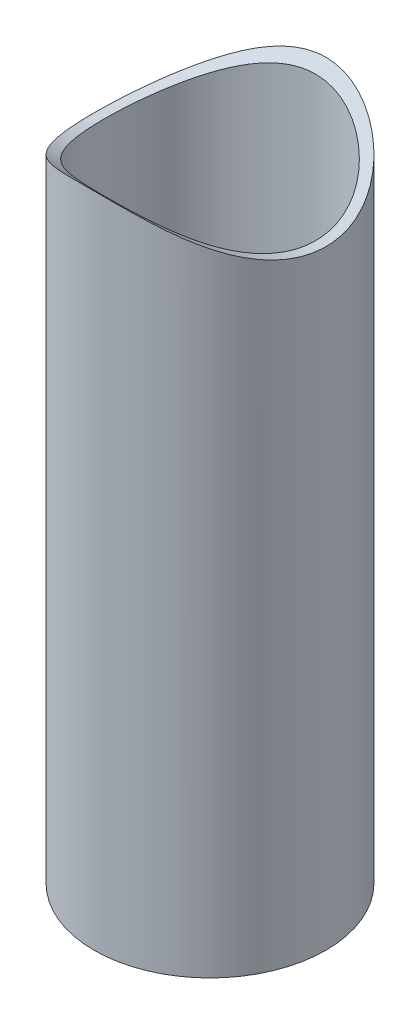
ISO-10303-21;
HEADER;
FILE_DESCRIPTION(('STEP AP214'),'2;1');
FILE_NAME('part.step','',(''),(''),'','','');
FILE_SCHEMA(('AUTOMOTIVE_DESIGN { 1 0 10303 214 1 1 1 1 }'));
ENDSEC;
DATA;
#1=APPLICATION_CONTEXT('core data for automotive mechanical design processes');
#2=APPLICATION_PROTOCOL_DEFINITION('international standard','automotive_design',2000,#1);
#3=PRODUCT_CONTEXT('',#1,'mechanical');
#4=PRODUCT('Part','Part','',(#3));
#5=PRODUCT_RELATED_PRODUCT_CATEGORY('part','',(#4));
#6=PRODUCT_DEFINITION_FORMATION('','',#4);
#7=PRODUCT_DEFINITION_CONTEXT('part definition',#1,'design');
#8=PRODUCT_DEFINITION('design','',#6,#7);
#9=PRODUCT_DEFINITION_SHAPE('','',#8);
#10=(LENGTH_UNIT() NAMED_UNIT(*) SI_UNIT(.MILLI.,.METRE.));
#11=(NAMED_UNIT(*) PLANE_ANGLE_UNIT() SI_UNIT($,.RADIAN.));
#12=(NAMED_UNIT(*) SI_UNIT($,.STERADIAN.) SOLID_ANGLE_UNIT());
#13=UNCERTAINTY_MEASURE_WITH_UNIT(LENGTH_MEASURE(1.E-05),#10,'distance_accuracy_value','');
#14=(GEOMETRIC_REPRESENTATION_CONTEXT(3) GLOBAL_UNCERTAINTY_ASSIGNED_CONTEXT((#13)) GLOBAL_UNIT_ASSIGNED_CONTEXT((#10,
#11,#12)) REPRESENTATION_CONTEXT('',''));
#15=CARTESIAN_POINT('',(0.,0.,0.));
#16=DIRECTION('',(0.,0.,1.));
#17=DIRECTION('',(1.,0.,0.));
#18=AXIS2_PLACEMENT_3D('',#15,#16,#17);
#19=CARTESIAN_POINT('',(0.,0.,0.));
#20=DIRECTION('',(0.,1.,0.));
#21=DIRECTION('',(0.,0.,1.));
#22=AXIS2_PLACEMENT_3D('',#19,#20,#21);
#23=PLANE('',#22);
#24=CARTESIAN_POINT('',(0.,0.,0.));
#25=DIRECTION('',(0.,1.,0.));
#26=DIRECTION('',(0.,0.,1.));
#27=AXIS2_PLACEMENT_3D('',#24,#25,#26);
#28=CIRCLE('',#27,11.25);
#29=CARTESIAN_POINT('',(0.,0.,11.25));
#30=VERTEX_POINT('',#29);
#31=EDGE_CURVE('E10',#30,#30,#28,.T.);
#32=ORIENTED_EDGE('',*,*,#31,.F.);
#33=EDGE_LOOP('',(#32));
#34=FACE_BOUND('',#33,.T.);
#35=CARTESIAN_POINT('',(0.,0.,0.));
#36=DIRECTION('',(0.,1.,0.));
#37=DIRECTION('',(0.,0.,1.));
#38=AXIS2_PLACEMENT_3D('',#35,#36,#37);
#39=CIRCLE('',#38,10.25);
#40=CARTESIAN_POINT('',(0.,0.,10.25));
#41=VERTEX_POINT('',#40);
#42=EDGE_CURVE('E45',#41,#41,#39,.T.);
#43=ORIENTED_EDGE('',*,*,#42,.T.);
#44=EDGE_LOOP('',(#43));
#45=FACE_BOUND('',#44,.T.);
#46=ADVANCED_FACE('F31',(#34,#45),#23,.F.);
#47=CARTESIAN_POINT('',(0.,75.,0.));
#48=DIRECTION('',(0.,-1.,0.));
#49=DIRECTION('',(0.,0.,-1.));
#50=AXIS2_PLACEMENT_3D('',#47,#48,#49);
#51=CYLINDRICAL_SURFACE('',#50,11.25);
#52=CARTESIAN_POINT('',(0.,63.7994140778261,-11.25));
#53=CARTESIAN_POINT('',(0.268811003720221,63.799413391012,-11.2499996461162));
#54=CARTESIAN_POINT('',(0.53762631981909,63.789690186868,-11.2403439362441));
#55=CARTESIAN_POINT('',(1.07252223460517,63.7513454899079,-11.2019692608378));
#56=CARTESIAN_POINT('',(1.33860264940994,63.7227227347036,-11.1732490218952));
#57=CARTESIAN_POINT('',(1.86615277060251,63.6480272371064,-11.0973491533534));
#58=CARTESIAN_POINT('',(2.12761189754367,63.6019188142837,-11.0501317728128));
#59=CARTESIAN_POINT('',(2.64351563178914,63.4944535712574,-10.9381910850598));
#60=CARTESIAN_POINT('',(2.89795982862723,63.4330958608635,-10.8734667558448));
#61=CARTESIAN_POINT('',(3.3955828736133,63.2984453926705,-10.7284157855639));
#62=CARTESIAN_POINT('',(3.63885940478733,63.225302472489,-10.6482828535399));
#63=CARTESIAN_POINT('',(4.11658845677837,63.0690131559117,-10.4728683573437));
#64=CARTESIAN_POINT('',(4.35103932136634,62.9858648940736,-10.3775839671954));
#65=CARTESIAN_POINT('',(4.81059037105051,62.8119046586515,-10.1727090082963));
#66=CARTESIAN_POINT('',(5.03569170390657,62.7210936299322,-10.0631202024563));
#67=CARTESIAN_POINT('',(5.47623422357856,62.5339455354634,-9.83033131551137));
#68=CARTESIAN_POINT('',(5.69167798136201,62.4376099561718,-9.70713488754289));
#69=CARTESIAN_POINT('',(6.15086636059338,62.2235421050837,-9.42415220487876));
#70=CARTESIAN_POINT('',(6.39268383153218,62.1050907651148,-9.26177785517575));
#71=CARTESIAN_POINT('',(6.86231514556401,61.8659350352109,-8.9193937825132));
#72=CARTESIAN_POINT('',(7.09012792748863,61.7452304754453,-8.73938272585259));
#73=CARTESIAN_POINT('',(7.53153830608032,61.5039634916011,-8.36198788166276));
#74=CARTESIAN_POINT('',(7.74511813440784,61.3834014231528,-8.16458306791041));
#75=CARTESIAN_POINT('',(8.15709261500274,61.14492577155,-7.753007619192));
#76=CARTESIAN_POINT('',(8.35548618183395,61.027012378134,-7.53883578801432));
#77=CARTESIAN_POINT('',(8.76914319438507,60.7760952179074,-7.05567094976546));
#78=CARTESIAN_POINT('',(8.98139135254403,60.6440078880117,-6.78360235978386));
#79=CARTESIAN_POINT('',(9.38198046536587,60.3900478924276,-6.21780431304551));
#80=CARTESIAN_POINT('',(9.57031685800644,60.268177177425,-5.92407073976931));
#81=CARTESIAN_POINT('',(9.92053304906848,60.0382927186621,-5.31678199830372));
#82=CARTESIAN_POINT('',(10.0824567408886,59.9302560506762,-5.00326094160448));
#83=CARTESIAN_POINT('',(10.377696641307,59.7311484572613,-4.35794216975222));
#84=CARTESIAN_POINT('',(10.5110257356245,59.6400698923716,-4.02615277201951));
#85=CARTESIAN_POINT('',(10.7142032296461,59.5002108350268,-3.44039684379724));
#86=CARTESIAN_POINT('',(10.7914283060122,59.4466842110526,-3.19009398178141));
#87=CARTESIAN_POINT('',(10.9286241213119,59.3511816079385,-2.68266708711938));
#88=CARTESIAN_POINT('',(10.988598586801,59.3092031342003,-2.42554454082044));
#89=CARTESIAN_POINT('',(11.0904851301886,59.2376819517206,-1.90620594293341));
#90=CARTESIAN_POINT('',(11.1324086109192,59.2081313925234,-1.64399321656343));
#91=CARTESIAN_POINT('',(11.1976570958508,59.1620672412235,-1.11610923279162));
#92=CARTESIAN_POINT('',(11.2209814623164,59.1455540961541,-0.85043785711536));
#93=CARTESIAN_POINT('',(11.2487080094209,59.1259185986958,-0.317061752957464));
#94=CARTESIAN_POINT('',(11.2530710777193,59.1228239252344,-0.0493539615114749));
#95=CARTESIAN_POINT('',(11.2427012902591,59.1301718943408,0.485502523470657));
#96=CARTESIAN_POINT('',(11.2279685066482,59.1406144857624,0.752651219115347));
#97=CARTESIAN_POINT('',(11.1796262376377,59.1748024770726,1.28442948505765));
#98=CARTESIAN_POINT('',(11.1460124617484,59.1985509005564,1.54905846887508));
#99=CARTESIAN_POINT('',(11.0603973522207,59.258824972304,2.07383584011655));
#100=CARTESIAN_POINT('',(11.0083960260662,59.2953506153675,2.33398422936419));
#101=CARTESIAN_POINT('',(10.8882322964263,59.3793428325505,2.84170032682708));
#102=CARTESIAN_POINT('',(10.8205035913794,59.4265149802338,3.08942001778571));
#103=CARTESIAN_POINT('',(10.6690443216533,59.5313657379496,3.57761309247467));
#104=CARTESIAN_POINT('',(10.5853141326871,59.5890441012958,3.81808664619004));
#105=CARTESIAN_POINT('',(10.4027399447576,59.7138727481105,4.29064852322362));
#106=CARTESIAN_POINT('',(10.3038971570903,59.7810222724187,4.52273751673463));
#107=CARTESIAN_POINT('',(10.091962742401,59.9237041516591,4.97773083886849));
#108=CARTESIAN_POINT('',(9.97886595700006,59.9992395401666,5.20063180348625));
#109=CARTESIAN_POINT('',(9.72597748715343,60.1663297896061,5.66076370809821));
#110=CARTESIAN_POINT('',(9.58461548414754,60.2587318104848,5.89682402575066));
#111=CARTESIAN_POINT('',(9.28647632683642,60.4508157154528,6.35600805046261));
#112=CARTESIAN_POINT('',(9.12969258769414,60.55050070454,6.57912616620133));
#113=CARTESIAN_POINT('',(8.80160406849753,60.7555295499426,7.01199594672053));
#114=CARTESIAN_POINT('',(8.63028673877262,60.8608782675086,7.22173577998731));
#115=CARTESIAN_POINT('',(8.27414421079265,61.0754034163583,7.62717711868959));
#116=CARTESIAN_POINT('',(8.08932274468131,61.1845787857614,7.82288247343434));
#117=CARTESIAN_POINT('',(7.6718790275028,61.4251463595919,8.2344187877781));
#118=CARTESIAN_POINT('',(7.43668799418483,61.5569576757937,8.44740667495005));
#119=CARTESIAN_POINT('',(6.94908769226748,61.8204383550061,8.85286667283798));
#120=CARTESIAN_POINT('',(6.6966749849997,61.9521076843033,9.04533466655089));
#121=CARTESIAN_POINT('',(6.1752441369748,62.2118941371352,9.40903332905816));
#122=CARTESIAN_POINT('',(5.90622598086884,62.3400112573864,9.58026397822187));
#123=CARTESIAN_POINT('',(5.35206635678809,62.5888570098322,9.90051767093094));
#124=CARTESIAN_POINT('',(5.06692942700671,62.7095877019169,10.0495469226802));
#125=CARTESIAN_POINT('',(4.54790879257755,62.9130906369293,10.2927818741794));
#126=CARTESIAN_POINT('',(4.31717603788739,62.9982382741621,10.3917378483788));
#127=CARTESIAN_POINT('',(3.84669744341365,63.1593346214484,10.5749302173689));
#128=CARTESIAN_POINT('',(3.60694929928199,63.2352809584024,10.6591628173364));
#129=CARTESIAN_POINT('',(3.11951913518782,63.3754506178696,10.8118553835039));
#130=CARTESIAN_POINT('',(2.87184932587115,63.4396910487348,10.8803384069638));
#131=CARTESIAN_POINT('',(2.36943669686568,63.5541450131579,11.0006789567882));
#132=CARTESIAN_POINT('',(2.11469794686136,63.604366440723,11.0525458420286));
#133=CARTESIAN_POINT('',(1.59660321339379,63.6891091939833,11.139260129902));
#134=CARTESIAN_POINT('',(1.33318157937589,63.7234418379997,11.1739033405085));
#135=CARTESIAN_POINT('',(0.802792107770165,63.7737831406769,11.2244808960869));
#136=CARTESIAN_POINT('',(0.535824428160728,63.7897926128943,11.2404160717043));
#137=CARTESIAN_POINT('',(0.00109138779576744,63.8026020136559,11.2531768254819));
#138=CARTESIAN_POINT('',(-0.266673539619473,63.7994109572083,11.2500113717438));
#139=CARTESIAN_POINT('',(-0.800372752046469,63.7740180211432,11.2246724349617));
#140=CARTESIAN_POINT('',(-1.06630713402997,63.751817156491,11.2024999667337));
#141=CARTESIAN_POINT('',(-1.55398507362989,63.6943164086713,11.1444386792882));
#142=CARTESIAN_POINT('',(-1.77633898702485,63.6615000699091,11.1111259554822));
#143=CARTESIAN_POINT('',(-2.21672612355845,63.584224091102,11.0317155753741));
#144=CARTESIAN_POINT('',(-2.43475778323593,63.5397603176851,10.9856133800773));
#145=CARTESIAN_POINT('',(-3.08111266272122,63.3909179082027,10.8289258408205));
#146=CARTESIAN_POINT('',(-3.50161443592174,63.2710986385009,10.6999695341487));
#147=CARTESIAN_POINT('',(-4.20972869917901,63.0378163099994,10.4376229326578));
#148=CARTESIAN_POINT('',(-4.50337805343626,62.9308579400287,10.3141763946153));
#149=CARTESIAN_POINT('',(-5.07588484543598,62.7057519476691,10.0447951472766));
#150=CARTESIAN_POINT('',(-5.35473610646314,62.5875997093926,9.89885114526656));
#151=CARTESIAN_POINT('',(-5.89739082743969,62.3440365582582,9.58549231054466));
#152=CARTESIAN_POINT('',(-6.16116857359313,62.2186139361783,9.41804228303174));
#153=CARTESIAN_POINT('',(-6.67276845857393,61.9642901824064,9.06276019579548));
#154=CARTESIAN_POINT('',(-6.92059247843593,61.8353894633545,8.87493054598372));
#155=CARTESIAN_POINT('',(-7.40485618146212,61.5745567354271,8.47533066285292));
#156=CARTESIAN_POINT('',(-7.64094369029476,61.4426183346329,8.26313771305478));
#157=CARTESIAN_POINT('',(-8.09515339390335,61.1815300539974,7.81869205086449));
#158=CARTESIAN_POINT('',(-8.3132742763457,61.05238037836,7.58643787567712));
#159=CARTESIAN_POINT('',(-8.73014206386881,60.7999635828784,7.10274044130658));
#160=CARTESIAN_POINT('',(-8.92891292240421,60.6766892889605,6.85132161201832));
#161=CARTESIAN_POINT('',(-9.30592518829865,60.4386812185084,6.32975114749195));
#162=CARTESIAN_POINT('',(-9.48417024657222,60.3239459244344,6.0596028573918));
#163=CARTESIAN_POINT('',(-9.79276579295155,60.1225030221349,5.54437164862811));
#164=CARTESIAN_POINT('',(-9.92626906782699,60.034195715233,5.30179948625074));
#165=CARTESIAN_POINT('',(-10.1761402122157,59.8673099891455,4.80478951040079));
#166=CARTESIAN_POINT('',(-10.292511171025,59.7887298163727,4.55035384707443));
#167=CARTESIAN_POINT('',(-10.5068589761413,59.6428829424944,4.03080000888376));
#168=CARTESIAN_POINT('',(-10.6048422080804,59.5756123146938,3.76568558150104));
#169=CARTESIAN_POINT('',(-10.7812343535702,59.4538085705912,3.22614746135921));
#170=CARTESIAN_POINT('',(-10.8596431290083,59.3992755441628,2.95172370293129));
#171=CARTESIAN_POINT('',(-10.9961791277706,59.3039280319926,2.39365154267039));
#172=CARTESIAN_POINT('',(-11.0541768103784,59.2632012264493,2.10995628335131));
#173=CARTESIAN_POINT('',(-11.1482637306113,59.1969689392565,1.53718424366902));
#174=CARTESIAN_POINT('',(-11.1843528719962,59.1714635244717,1.24810743967144));
#175=CARTESIAN_POINT('',(-11.2339816308157,59.1363572839206,0.667167517872181));
#176=CARTESIAN_POINT('',(-11.2475297070162,59.1267504920401,0.375305486625605));
#177=CARTESIAN_POINT('',(-11.2518531442979,59.1236868544293,-0.20865821579173));
#178=CARTESIAN_POINT('',(-11.2426304311132,59.1302286430075,-0.500759864609449));
#179=CARTESIAN_POINT('',(-11.2037142309464,59.1577723002531,-1.0524665348448));
#180=CARTESIAN_POINT('',(-11.1762345803612,59.1772100770658,-1.31231048852097));
#181=CARTESIAN_POINT('',(-11.1035089737176,59.2284949816678,-1.82823519112016));
#182=CARTESIAN_POINT('',(-11.058264469207,59.2603410955832,-2.08431624573269));
#183=CARTESIAN_POINT('',(-10.9506098515158,59.3357889379575,-2.59109294972726));
#184=CARTESIAN_POINT('',(-10.8881979001677,59.3793919252485,-2.84178801931583));
#185=CARTESIAN_POINT('',(-10.7469799791852,59.477496125694,-3.33632480986472));
#186=CARTESIAN_POINT('',(-10.6681732303411,59.5319978568378,-3.58016620445899));
#187=CARTESIAN_POINT('',(-10.4926229204947,59.6525548743157,-4.06645109393132));
#188=CARTESIAN_POINT('',(-10.3954414944683,59.7188893080037,-4.30866713704696));
#189=CARTESIAN_POINT('',(-10.1856525275105,59.8608225415586,-4.78355860245557));
#190=CARTESIAN_POINT('',(-10.073039480508,59.9364246471525,-5.01623058070754));
#191=CARTESIAN_POINT('',(-9.71361617454146,60.1751816841393,-5.69843540754704));
#192=CARTESIAN_POINT('',(-9.44509278397483,60.3503775211981,-6.13250934118552));
#193=CARTESIAN_POINT('',(-8.8117440605553,60.7511234736517,-7.01831430969059));
#194=CARTESIAN_POINT('',(-8.43844128241693,60.9802688353657,-7.4623363319248));
#195=CARTESIAN_POINT('',(-7.83372280968603,61.3327531682324,-8.07951258095862));
#196=CARTESIAN_POINT('',(-7.62437524255705,61.4518763063052,-8.27732986124854));
#197=CARTESIAN_POINT('',(-7.19136838571014,61.6907455773943,-8.65617954325144));
#198=CARTESIAN_POINT('',(-6.96771227013593,61.8104915668624,-8.83721564595298));
#199=CARTESIAN_POINT('',(-6.46802780233641,62.068051547768,-9.21086467242101));
#200=CARTESIAN_POINT('',(-6.18948918840681,62.2055449141952,-9.40036560976118));
#201=CARTESIAN_POINT('',(-5.75805668033988,62.4066608928237,-9.66622017545936));
#202=CARTESIAN_POINT('',(-5.61195724418793,62.4728529620348,-9.75178113020174));
#203=CARTESIAN_POINT('',(-5.31517352170665,62.6029682797891,-9.91666601836009));
#204=CARTESIAN_POINT('',(-5.16448670524357,62.6668902325648,-9.99598642012983));
#205=CARTESIAN_POINT('',(-4.70640794596401,62.8539822000418,-10.223913841299));
#206=CARTESIAN_POINT('',(-4.39233192756733,62.9727941635141,-10.3628985793277));
#207=CARTESIAN_POINT('',(-3.74755392769572,63.1929816721282,-10.6130938506382));
#208=CARTESIAN_POINT('',(-3.41686266020131,63.2943682717943,-10.7243220128846));
#209=CARTESIAN_POINT('',(-2.83347879958524,63.4489924682927,-10.8903148268277));
#210=CARTESIAN_POINT('',(-2.5842817949551,63.5078082901241,-10.9521981496611));
#211=CARTESIAN_POINT('',(-2.07931707674639,63.6107220364131,-11.0591817612024));
#212=CARTESIAN_POINT('',(-1.82355065842257,63.654822838521,-11.1042853315356));
#213=CARTESIAN_POINT('',(-1.30776071994207,63.7262114366,-11.1767579442723));
#214=CARTESIAN_POINT('',(-1.04774800686505,63.7535366350191,-11.2041664462365));
#215=CARTESIAN_POINT('',(-0.525158241201371,63.7901383284281,-11.2407876845934));
#216=CARTESIAN_POINT('',(-0.262581178006634,63.799414748723,-11.2500003456823));
#217=CARTESIAN_POINT('',(0.,63.7994140778261,-11.25));
#218=B_SPLINE_CURVE_WITH_KNOTS('',3,(#52,#53,#54,#55,#56,#57,#58,#59,#60,#61,#62,#63,#64,#65,
#66,#67,#68,#69,#70,#71,#72,#73,#74,#75,#76,#77,#78,#79,#80,#81,#82,#83,#84,#85,#86,#87,#88,#89,
#90,#91,#92,#93,#94,#95,#96,#97,#98,#99,#100,#101,#102,#103,#104,#105,#106,#107,#108,#109,#110,
#111,#112,#113,#114,#115,#116,#117,#118,#119,#120,#121,#122,#123,#124,#125,#126,#127,#128,#129,
#130,#131,#132,#133,#134,#135,#136,#137,#138,#139,#140,#141,#142,#143,#144,#145,#146,#147,#148,
#149,#150,#151,#152,#153,#154,#155,#156,#157,#158,#159,#160,#161,#162,#163,#164,#165,#166,#167,
#168,#169,#170,#171,#172,#173,#174,#175,#176,#177,#178,#179,#180,#181,#182,#183,#184,#185,#186,
#187,#188,#189,#190,#191,#192,#193,#194,#195,#196,#197,#198,#199,#200,#201,#202,#203,#204,#205,
#206,#207,#208,#209,#210,#211,#212,#213,#214,#215,#216,#217),.UNSPECIFIED.,.T.,.F.,(4,2,2,2,2,2,
2,2,2,2,2,2,2,2,2,2,2,2,2,2,2,2,2,2,2,2,2,2,2,2,2,2,2,2,2,2,2,2,2,2,2,2,2,2,2,2,2,2,2,2,2,2,2,2,
2,2,2,2,2,2,2,2,2,2,2,2,2,2,2,2,2,2,2,2,2,2,2,2,2,2,2,2,4),(0.,0.806099912856146,
1.61225367429112,2.42006136455049,3.22791622235719,4.02621059299705,4.82465403263785,
5.62299916292756,6.42113048601807,7.36358620592042,8.30611325012278,9.24979571142574,
10.193545559457,11.300492210097,12.4076497339588,13.5129481814949,14.6177474916722,
15.4190081780607,16.2200956422483,17.0206763132783,17.8212844338254,18.6235432240078,
19.4257989831174,20.2282371194694,21.030674929221,21.8131728580943,22.5956524162612,
23.3780692904344,24.1607701308699,25.0306813328503,25.900965598959,26.7720091523546,
27.6428128790682,28.6725006660345,29.7023946568774,30.7322895996916,31.7618960089581,
32.5565676184092,33.3514437465914,34.1451486672917,34.9384057523247,35.7408553392954,
36.5432692957844,37.3453065332854,38.1473009513517,38.8282188883316,39.5093787935195,
40.8719439449827,41.8788443980716,42.8861618774857,43.8951493624985,44.904017663458,
45.9342483593573,46.9645542396367,47.9935680350419,49.0223985166042,49.8934282286728,
50.7643006839444,51.6348701434142,52.5054457452331,53.3814509043578,54.2574599115785,
55.1331401132278,56.0087462608152,56.7938713447507,57.5789322902721,58.3640773272509,
59.1492596890298,59.9562774572954,60.7635839265201,62.3770510887099,64.2408434270718,
65.1752742762908,66.1094985495854,67.1996694591676,67.7448821131989,68.2904011264942,
69.3789165193181,70.4667387963709,71.2560741336171,72.0452550188737,72.8326699155855,
73.620088071016),.UNSPECIFIED.);
#219=CARTESIAN_POINT('',(0.,63.7994140778261,-11.25));
#220=VERTEX_POINT('',#219);
#221=EDGE_CURVE('E49',#220,#220,#218,.T.);
#222=ORIENTED_EDGE('',*,*,#221,.T.);
#223=EDGE_LOOP('',(#222));
#224=FACE_BOUND('',#223,.T.);
#225=ORIENTED_EDGE('',*,*,#31,.T.);
#226=EDGE_LOOP('',(#225));
#227=FACE_BOUND('',#226,.T.);
#228=ADVANCED_FACE('F33',(#224,#227),#51,.T.);
#229=CARTESIAN_POINT('',(0.,75.,0.));
#230=DIRECTION('',(0.,-1.,0.));
#231=DIRECTION('',(0.,0.,-1.));
#232=AXIS2_PLACEMENT_3D('',#229,#230,#231);
#233=CYLINDRICAL_SURFACE('',#232,10.25);
#234=CARTESIAN_POINT('',(0.,62.8775775935665,-10.25));
#235=CARTESIAN_POINT('',(0.252703817800608,62.8775889200801,-10.2500067562332));
#236=CARTESIAN_POINT('',(0.505348553725416,62.8696482014816,-10.2406423328487));
#237=CARTESIAN_POINT('',(1.00838796785108,62.8382975750862,-10.2033935144312));
#238=CARTESIAN_POINT('',(1.25878198004191,62.8148832319451,-10.1755038093182));
#239=CARTESIAN_POINT('',(1.75540818443383,62.7536239340378,-10.1016917028005));
#240=CARTESIAN_POINT('',(2.00163449681924,62.7157601209282,-10.0557457333949));
#241=CARTESIAN_POINT('',(2.48797056353355,62.6272113963,-9.94659029103699));
#242=CARTESIAN_POINT('',(2.72807716755382,62.5765200224882,-9.88337211537625));
#243=CARTESIAN_POINT('',(3.1984712001701,62.4647846752054,-9.74125603496625));
#244=CARTESIAN_POINT('',(3.42883061033735,62.4038444234502,-9.66251398217388));
#245=CARTESIAN_POINT('',(3.88126688229224,62.2732405522752,-9.48983508272149));
#246=CARTESIAN_POINT('',(4.10333987313026,62.2035729205195,-9.39589124134069));
#247=CARTESIAN_POINT('',(4.75599174799267,61.9844486306535,-9.09247200104545));
#248=CARTESIAN_POINT('',(5.17336090035789,61.8247803028319,-8.86129921185245));
#249=CARTESIAN_POINT('',(5.79814453426782,61.5638954048936,-8.4568070441787));
#250=CARTESIAN_POINT('',(6.01906328181033,61.4668575583058,-8.30097936455207));
#251=CARTESIAN_POINT('',(6.44744493438465,61.270964848932,-7.97280854496694));
#252=CARTESIAN_POINT('',(6.65491043854466,61.1721103418845,-7.80046861116466));
#253=CARTESIAN_POINT('',(7.05591336983638,60.9747176759778,-7.43971874353935));
#254=CARTESIAN_POINT('',(7.24943709520893,60.8761799168581,-7.25129338801165));
#255=CARTESIAN_POINT('',(7.62160797849357,60.6815894816928,-6.85905807519319));
#256=CARTESIAN_POINT('',(7.80025420107456,60.5855369621527,-6.65524715216329));
#257=CARTESIAN_POINT('',(8.16437735338487,60.3854843964194,-6.20483956841696));
#258=CARTESIAN_POINT('',(8.347626153504,60.2821162597734,-5.95615107853605));
#259=CARTESIAN_POINT('',(8.69226517694432,60.0839437971178,-5.44087061367374));
#260=CARTESIAN_POINT('',(8.8536580414153,59.9891384368135,-5.17428080778626));
#261=CARTESIAN_POINT('',(9.15271488934432,59.8108290124606,-4.62472597824457));
#262=CARTESIAN_POINT('',(9.29039483367763,59.7273173549563,-4.34177214172367));
#263=CARTESIAN_POINT('',(9.54020352503218,59.5740843944732,-3.76122517249124));
#264=CARTESIAN_POINT('',(9.65233731510724,59.5043603700439,-3.46363494327105));
#265=CARTESIAN_POINT('',(9.83864902799566,59.3875863510765,-2.88873551865232));
#266=CARTESIAN_POINT('',(9.91560173280795,59.3389099922633,-2.61265506628296));
#267=CARTESIAN_POINT('',(10.0464121847839,59.2557640319231,-2.05296390207056));
#268=CARTESIAN_POINT('',(10.1002714215635,59.2212935140713,-1.76935367717983));
#269=CARTESIAN_POINT('',(10.1839117377122,59.1676232011248,-1.19744824280894));
#270=CARTESIAN_POINT('',(10.2137158665978,59.1484087879738,-0.909157788825893));
#271=CARTESIAN_POINT('',(10.248769104145,59.1258005807491,-0.330482816377134));
#272=CARTESIAN_POINT('',(10.2540213403824,59.1224047716013,-0.0400985693523254));
#273=CARTESIAN_POINT('',(10.2409002659287,59.1308740507651,0.498246152060789));
#274=CARTESIAN_POINT('',(10.2258017699769,59.1406238401141,0.746328236861328));
#275=CARTESIAN_POINT('',(10.1777361513378,59.1715731482097,1.24003534867923));
#276=CARTESIAN_POINT('',(10.1447693141144,59.1927724840387,1.48566041488597));
#277=CARTESIAN_POINT('',(10.0614101679141,59.2461408859776,1.97270780537264));
#278=CARTESIAN_POINT('',(10.0110180390176,59.2783098387226,2.21413017305796));
#279=CARTESIAN_POINT('',(9.89344073328973,59.352916212991,2.69122618321861));
#280=CARTESIAN_POINT('',(9.82625483897227,59.3953540732342,2.92689957960626));
#281=CARTESIAN_POINT('',(9.67591884767997,59.4895807894395,3.39094985837316));
#282=CARTESIAN_POINT('',(9.59278119349991,59.5413623552014,3.61933226701871));
#283=CARTESIAN_POINT('',(9.4113217969281,59.6533064426983,4.0679344474934));
#284=CARTESIAN_POINT('',(9.31299503707492,59.7134717332079,4.28815149211798));
#285=CARTESIAN_POINT('',(9.10206802478372,59.8410516309014,4.71937049994004));
#286=CARTESIAN_POINT('',(8.98947126693608,59.9084644626185,4.93037470232481));
#287=CARTESIAN_POINT('',(8.75078795430318,60.0494101592311,5.34256074848142));
#288=CARTESIAN_POINT('',(8.62469657650538,60.1229452101246,5.54373904278394));
#289=CARTESIAN_POINT('',(8.34291114353216,60.2846230263138,5.96066015543035));
#290=CARTESIAN_POINT('',(8.18549314343107,60.3734318657868,6.17498066036391));
#291=CARTESIAN_POINT('',(7.85547536083779,60.5555315075399,6.58971007112538));
#292=CARTESIAN_POINT('',(7.68286875359635,60.6488243159851,6.79011265005275));
#293=CARTESIAN_POINT('',(7.32313388888925,60.8381503228382,7.17662944803428));
#294=CARTESIAN_POINT('',(7.13598536859106,60.9341872227434,7.36272298397318));
#295=CARTESIAN_POINT('',(6.74817875688552,61.1269059722125,7.71971669071879));
#296=CARTESIAN_POINT('',(6.54752530486294,61.2235875901155,7.89062203282091));
#297=CARTESIAN_POINT('',(6.10355312140652,61.4293542810382,8.24014489370195));
#298=CARTESIAN_POINT('',(5.85823990794198,61.5382323967724,8.41636067158661));
#299=CARTESIAN_POINT('',(5.35139818827169,61.7509367239304,8.74738058010989));
#300=CARTESIAN_POINT('',(5.08986634267342,61.8547618870518,8.90218027986882));
#301=CARTESIAN_POINT('',(4.55184517965799,62.0535708427431,9.18890589846499));
#302=CARTESIAN_POINT('',(4.27537795700544,62.1485671590397,9.32086445410096));
#303=CARTESIAN_POINT('',(3.70831037620534,62.3259205188968,9.56062703032102));
#304=CARTESIAN_POINT('',(3.41771644935617,62.4082832443377,9.66844191946543));
#305=CARTESIAN_POINT('',(2.90565506889811,62.5359527278277,9.83212936258641));
#306=CARTESIAN_POINT('',(2.68712075994657,62.5852242094561,9.89413524226386));
#307=CARTESIAN_POINT('',(2.24446902333252,62.6734525076502,10.0038400875348));
#308=CARTESIAN_POINT('',(2.02035305706581,62.7124119936888,10.0515427562353));
#309=CARTESIAN_POINT('',(1.56802675885294,62.7786310806621,10.1319537296197));
#310=CARTESIAN_POINT('',(1.33982202970415,62.8059055807398,10.1646811324223));
#311=CARTESIAN_POINT('',(0.880556484706741,62.8477891396435,10.2147182515809));
#312=CARTESIAN_POINT('',(0.649495639333094,62.8623980674282,10.2320278084201));
#313=CARTESIAN_POINT('',(0.185514595827713,62.8783822094351,10.2509592406826));
#314=CARTESIAN_POINT('',(-0.0474092054736502,62.8797142279129,10.2525299105314));
#315=CARTESIAN_POINT('',(-0.512510228442802,62.8689763270063,10.2398220830188));
#316=CARTESIAN_POINT('',(-0.744687446414937,62.8569063413829,10.2255435073229));
#317=CARTESIAN_POINT('',(-1.20666758175548,62.8198478555189,10.1813723201776));
#318=CARTESIAN_POINT('',(-1.43646864891145,62.7948499633161,10.1514683569159));
#319=CARTESIAN_POINT('',(-1.89193443886755,62.7329052045386,10.0765254359947));
#320=CARTESIAN_POINT('',(-2.11759907377295,62.695958084366,10.0314861571182));
#321=CARTESIAN_POINT('',(-2.55639469096452,62.6127748332007,9.9285698420446));
#322=CARTESIAN_POINT('',(-2.76969600583666,62.566871687945,9.87114690610753));
#323=CARTESIAN_POINT('',(-3.19032287407396,62.4664640369577,9.74334199841205));
#324=CARTESIAN_POINT('',(-3.39764634968085,62.411956582192,9.67295558217694));
#325=CARTESIAN_POINT('',(-4.00956867130066,62.2376741896118,9.44327901242458));
#326=CARTESIAN_POINT('',(-4.40434700343591,62.1070934333393,9.26541725310919));
#327=CARTESIAN_POINT('',(-5.01074622584537,61.8845129429646,8.94544426222158));
#328=CARTESIAN_POINT('',(-5.23227662324236,61.7980674180697,8.81764214952943));
#329=CARTESIAN_POINT('',(-5.66409739735913,61.6210472165645,8.54666126845398));
#330=CARTESIAN_POINT('',(-5.8743866851391,61.5304721414887,8.40348101439989));
#331=CARTESIAN_POINT('',(-6.28338141018844,61.3471418096631,8.1022354217141));
#332=CARTESIAN_POINT('',(-6.48207392957139,61.2543842772723,7.94415397806119));
#333=CARTESIAN_POINT('',(-6.86714371352579,61.0686557797796,7.6137503897234));
#334=CARTESIAN_POINT('',(-7.05352049462707,60.9756848064468,7.44142768657649));
#335=CARTESIAN_POINT('',(-7.44730610297893,60.7739060333644,7.04920098956451));
#336=CARTESIAN_POINT('',(-7.65205654060257,60.6654166719845,6.82645112785429));
#337=CARTESIAN_POINT('',(-8.04214425195587,60.4534400244455,6.36225849373535));
#338=CARTESIAN_POINT('',(-8.22747821266343,60.3499535935505,6.12081254340747));
#339=CARTESIAN_POINT('',(-8.57709442131717,60.1507894431171,5.62041135649353));
#340=CARTESIAN_POINT('',(-8.74139434486712,60.0551051920275,5.36147110427546));
#341=CARTESIAN_POINT('',(-9.04740784059802,59.8740786701578,4.8271753631324));
#342=CARTESIAN_POINT('',(-9.18912772023616,59.7887335128813,4.55182448794757));
#343=CARTESIAN_POINT('',(-9.42238269951672,59.6465745379912,4.04267964712983));
#344=CARTESIAN_POINT('',(-9.51829213670212,59.5874628987713,3.81152204591605));
#345=CARTESIAN_POINT('',(-9.69350981804273,59.4786425137233,3.34086676212228));
#346=CARTESIAN_POINT('',(-9.77282109754075,59.4289320488415,3.10137061379121));
#347=CARTESIAN_POINT('',(-9.91390482822552,59.3399988421312,2.61551860685753));
#348=CARTESIAN_POINT('',(-9.97568821384207,59.3007695627161,2.36916713062255));
#349=CARTESIAN_POINT('',(-10.0809945855702,59.2336456673124,1.87105398195909));
#350=CARTESIAN_POINT('',(-10.1245172401296,59.2057512571265,1.61929221138548));
#351=CARTESIAN_POINT('',(-10.192814522614,59.1618844629602,1.11128114184198));
#352=CARTESIAN_POINT('',(-10.2175218952588,59.145954849932,0.855019063555131));
#353=CARTESIAN_POINT('',(-10.2475656623535,59.1265758412697,0.340886977599693));
#354=CARTESIAN_POINT('',(-10.2529020497426,59.1231264501847,0.0830169693450511));
#355=CARTESIAN_POINT('',(-10.2441227816987,59.128794443489,-0.432263386855775));
#356=CARTESIAN_POINT('',(-10.2300061783702,59.1379124402556,-0.689673711790751));
#357=CARTESIAN_POINT('',(-10.1825318978815,59.168488667942,-1.20196295673216));
#358=CARTESIAN_POINT('',(-10.1491747681077,59.1899465477963,-1.45684194854432));
#359=CARTESIAN_POINT('',(-10.0661079261261,59.2431380130874,-1.94794154241641));
#360=CARTESIAN_POINT('',(-10.0174209495651,59.2742273630097,-2.1844065374277));
#361=CARTESIAN_POINT('',(-9.90393255674512,59.3462757397586,-2.65188072416797));
#362=CARTESIAN_POINT('',(-9.83913187644961,59.3872343158241,-2.88289016454175));
#363=CARTESIAN_POINT('',(-9.69413703882377,59.4782013783381,-3.33815520499125));
#364=CARTESIAN_POINT('',(-9.61394439522788,59.5282089748262,-3.56241146670654));
#365=CARTESIAN_POINT('',(-9.4389194769728,59.6363548885894,-4.00319348470534));
#366=CARTESIAN_POINT('',(-9.34408180596777,59.6944962022009,-4.21971635505905));
#367=CARTESIAN_POINT('',(-9.13328165395817,59.8223047176753,-4.65932219971372));
#368=CARTESIAN_POINT('',(-9.01629077736451,59.8924999765317,-4.88175817747763));
#369=CARTESIAN_POINT('',(-8.76737381418018,60.0397228142495,-5.31585299945728));
#370=CARTESIAN_POINT('',(-8.63544139405158,60.1167532874571,-5.52750721788784));
#371=CARTESIAN_POINT('',(-8.35753560734244,60.276258223752,-5.93934643259308));
#372=CARTESIAN_POINT('',(-8.21155670118337,60.3587348306001,-6.1395268538209));
#373=CARTESIAN_POINT('',(-7.90641034457559,60.5276710647898,-6.52779876425019));
#374=CARTESIAN_POINT('',(-7.74724154716093,60.6141310985219,-6.7158890152991));
#375=CARTESIAN_POINT('',(-7.39089879522217,60.8030887656902,-7.10757457361436));
#376=CARTESIAN_POINT('',(-7.19164987642476,60.906002840953,-7.30908545740169));
#377=CARTESIAN_POINT('',(-6.7774256805406,61.1127968288988,-7.6947449898007));
#378=CARTESIAN_POINT('',(-6.56244811406381,61.2166768802563,-7.87889110191146));
#379=CARTESIAN_POINT('',(-6.11743456692802,61.4229151404753,-8.22919926331323));
#380=CARTESIAN_POINT('',(-5.88739175370686,61.5252726326202,-8.39535306060176));
#381=CARTESIAN_POINT('',(-5.41301607860998,61.7256765959198,-8.70876290100382));
#382=CARTESIAN_POINT('',(-5.16868538275569,61.8237237165927,-8.85602179779964));
#383=CARTESIAN_POINT('',(-4.69871641585608,62.0003862849725,-9.11299983271356));
#384=CARTESIAN_POINT('',(-4.4747152886585,62.0798791125954,-9.2251112200857));
#385=CARTESIAN_POINT('',(-4.01691207196479,62.2312081966184,-9.43345959250075));
#386=CARTESIAN_POINT('',(-3.78310983790769,62.303044340031,-9.52969634329805));
#387=CARTESIAN_POINT('',(-3.30698918602406,62.4366705516391,-9.70518073517562));
#388=CARTESIAN_POINT('',(-3.06468987384833,62.4984815952073,-9.78446396158458));
#389=CARTESIAN_POINT('',(-2.57234991974771,62.6099793269685,-9.92527430050011));
#390=CARTESIAN_POINT('',(-2.32231199857643,62.6596702230222,-9.9868075767759));
#391=CARTESIAN_POINT('',(-1.73200719328553,62.7589687313137,-10.1084593224266));
#392=CARTESIAN_POINT('',(-1.38927054730001,62.8031038827536,-10.1613669365103));
#393=CARTESIAN_POINT('',(-0.697651368427092,62.8623991410852,-10.2321309718461));
#394=CARTESIAN_POINT('',(-0.348769414143351,62.877561961268,-10.2499906753784));
#395=CARTESIAN_POINT('',(0.,62.8775775935665,-10.25));
#396=B_SPLINE_CURVE_WITH_KNOTS('',3,(#234,#235,#236,#237,#238,#239,#240,#241,#242,#243,#244,
#245,#246,#247,#248,#249,#250,#251,#252,#253,#254,#255,#256,#257,#258,#259,#260,#261,#262,#263,
#264,#265,#266,#267,#268,#269,#270,#271,#272,#273,#274,#275,#276,#277,#278,#279,#280,#281,#282,
#283,#284,#285,#286,#287,#288,#289,#290,#291,#292,#293,#294,#295,#296,#297,#298,#299,#300,#301,
#302,#303,#304,#305,#306,#307,#308,#309,#310,#311,#312,#313,#314,#315,#316,#317,#318,#319,#320,
#321,#322,#323,#324,#325,#326,#327,#328,#329,#330,#331,#332,#333,#334,#335,#336,#337,#338,#339,
#340,#341,#342,#343,#344,#345,#346,#347,#348,#349,#350,#351,#352,#353,#354,#355,#356,#357,#358,
#359,#360,#361,#362,#363,#364,#365,#366,#367,#368,#369,#370,#371,#372,#373,#374,#375,#376,#377,
#378,#379,#380,#381,#382,#383,#384,#385,#386,#387,#388,#389,#390,#391,#392,#393,#394,#395),
.UNSPECIFIED.,.T.,.F.,(4,2,2,2,2,2,2,2,2,2,2,2,2,2,2,2,2,2,2,2,2,2,2,2,2,2,2,2,2,2,2,2,2,2,2,2,
2,2,2,2,2,2,2,2,2,2,2,2,2,2,2,2,2,2,2,2,2,2,2,2,2,2,2,2,2,2,2,2,2,2,2,2,2,2,2,2,2,2,2,2,4),(0.,
0.757716903697973,1.51565109287678,2.27457788170424,3.03388776794975,3.78593073852621,
4.53832073188079,6.04195802679341,6.90305117200295,7.76397745775756,8.62573862093654,
9.48755392118975,10.4634925121786,11.4393130617999,12.4144742097314,13.3894426844441,
14.2602761503662,15.1310534357873,16.0009953517102,16.8708264458958,17.6161236776316,
18.3614090028786,19.106686626258,19.8519960958482,20.5967265505554,21.3417035423931,
22.0864984475179,22.8315604389076,23.6717978094714,24.5124146737234,25.3542246228111,
26.195746844387,27.1578056274236,28.120063158901,29.0809342008819,30.0413718218414,
30.7380415043098,31.4345306626723,32.1301290881611,32.8257347104044,33.523602714083,
34.2214741669682,34.9198533284148,35.6182473125027,36.2944184002929,36.9708217436066,
38.3229195170925,39.1322606700257,39.9416800832568,40.7519845626165,41.5623208326483,
42.5254144423062,43.4886721173308,44.4511149459768,45.413288454932,46.1839608788959,
46.9544922448518,47.7245418677427,48.4946054714866,49.2674089143491,50.0402126388959,
50.8130540215599,51.5858734182361,52.3153232686094,53.044739808839,53.7740846507616,
54.5036988831016,55.2857524595459,56.0681387885747,56.8508349455562,57.6336111310489,
58.5371459191036,59.4408124841978,60.3448917673907,61.2488343470616,62.036524620449,
62.824226515929,63.6102584386147,64.3960170778334,65.4418787330274,66.4876424373089),.UNSPECIFIED.);
#397=CARTESIAN_POINT('',(0.,62.8775775935665,-10.25));
#398=VERTEX_POINT('',#397);
#399=EDGE_CURVE('E36',#398,#398,#396,.T.);
#400=ORIENTED_EDGE('',*,*,#399,.F.);
#401=EDGE_LOOP('',(#400));
#402=FACE_BOUND('',#401,.T.);
#403=ORIENTED_EDGE('',*,*,#42,.F.);
#404=EDGE_LOOP('',(#403));
#405=FACE_BOUND('',#404,.T.);
#406=ADVANCED_FACE('F59',(#402,#405),#233,.F.);
#407=CARTESIAN_POINT('',(-75.4581230215663,75.0000000000005,0.));
#408=DIRECTION('',(1.,0.,0.));
#409=DIRECTION('',(0.,1.,0.));
#410=AXIS2_PLACEMENT_3D('',#407,#408,#409);
#411=CYLINDRICAL_SURFACE('',#410,15.875);
#412=ORIENTED_EDGE('',*,*,#399,.T.);
#413=EDGE_LOOP('',(#412));
#414=FACE_BOUND('',#413,.T.);
#415=ORIENTED_EDGE('',*,*,#221,.F.);
#416=EDGE_LOOP('',(#415));
#417=FACE_BOUND('',#416,.T.);
#418=ADVANCED_FACE('F56',(#414,#417),#411,.F.);
#419=CLOSED_SHELL('',(#46,#228,#406,#418));
#420=MANIFOLD_SOLID_BREP('B2',#419);
#421=ADVANCED_BREP_SHAPE_REPRESENTATION('',(#18,#420),#14);
#422=SHAPE_DEFINITION_REPRESENTATION(#9,#421);
ENDSEC;
END-ISO-10303-21;
